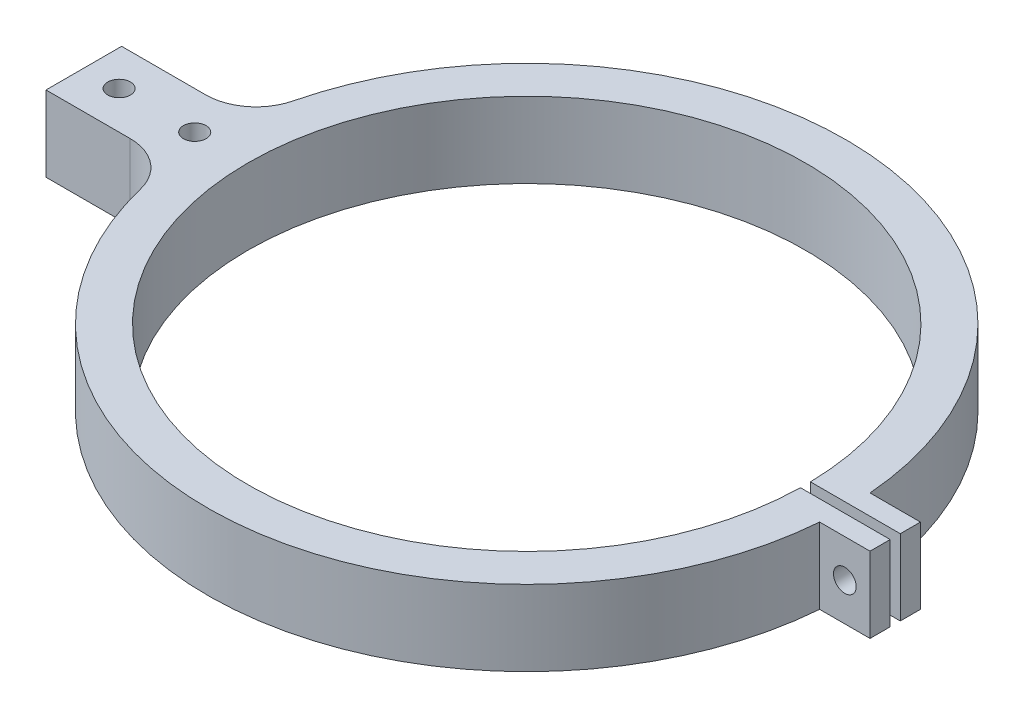
ISO-10303-21;
HEADER;
FILE_DESCRIPTION(('STEP AP214'),'2;1');
FILE_NAME('part.step','',(''),(''),'','','');
FILE_SCHEMA(('AUTOMOTIVE_DESIGN { 1 0 10303 214 1 1 1 1 }'));
ENDSEC;
DATA;
#1=APPLICATION_CONTEXT('core data for automotive mechanical design processes');
#2=APPLICATION_PROTOCOL_DEFINITION('international standard','automotive_design',2000,#1);
#3=PRODUCT_CONTEXT('',#1,'mechanical');
#4=PRODUCT('Part','Part','',(#3));
#5=PRODUCT_RELATED_PRODUCT_CATEGORY('part','',(#4));
#6=PRODUCT_DEFINITION_FORMATION('','',#4);
#7=PRODUCT_DEFINITION_CONTEXT('part definition',#1,'design');
#8=PRODUCT_DEFINITION('design','',#6,#7);
#9=PRODUCT_DEFINITION_SHAPE('','',#8);
#10=(LENGTH_UNIT() NAMED_UNIT(*) SI_UNIT(.MILLI.,.METRE.));
#11=(NAMED_UNIT(*) PLANE_ANGLE_UNIT() SI_UNIT($,.RADIAN.));
#12=(NAMED_UNIT(*) SI_UNIT($,.STERADIAN.) SOLID_ANGLE_UNIT());
#13=UNCERTAINTY_MEASURE_WITH_UNIT(LENGTH_MEASURE(1.E-05),#10,'distance_accuracy_value','');
#14=(GEOMETRIC_REPRESENTATION_CONTEXT(3) GLOBAL_UNCERTAINTY_ASSIGNED_CONTEXT((#13)) GLOBAL_UNIT_ASSIGNED_CONTEXT((#10,
#11,#12)) REPRESENTATION_CONTEXT('',''));
#15=CARTESIAN_POINT('',(0.,0.,0.));
#16=DIRECTION('',(0.,0.,1.));
#17=DIRECTION('',(1.,0.,0.));
#18=AXIS2_PLACEMENT_3D('',#15,#16,#17);
#19=CARTESIAN_POINT('',(0.,15.,0.));
#20=DIRECTION('',(0.,1.,0.));
#21=DIRECTION('',(0.,0.,1.));
#22=AXIS2_PLACEMENT_3D('',#19,#20,#21);
#23=PLANE('',#22);
#24=CARTESIAN_POINT('',(-80.8541168102774,15.,0.));
#25=DIRECTION('',(0.,1.,0.));
#26=DIRECTION('',(0.,0.,1.));
#27=AXIS2_PLACEMENT_3D('',#24,#25,#26);
#28=CIRCLE('',#27,2.25);
#29=CARTESIAN_POINT('',(-80.8541168102774,15.,2.25));
#30=VERTEX_POINT('',#29);
#31=EDGE_CURVE('E184',#30,#30,#28,.T.);
#32=ORIENTED_EDGE('',*,*,#31,.F.);
#33=EDGE_LOOP('',(#32));
#34=FACE_BOUND('',#33,.T.);
#35=CARTESIAN_POINT('',(0.,15.,0.));
#36=DIRECTION('',(0.,1.,0.));
#37=DIRECTION('',(0.,0.,1.));
#38=AXIS2_PLACEMENT_3D('',#35,#36,#37);
#39=CIRCLE('',#38,63.3);
#40=CARTESIAN_POINT('',(63.1022186614702,15.,-5.));
#41=VERTEX_POINT('',#40);
#42=CARTESIAN_POINT('',(-61.4695111209446,15.,-15.112551159618));
#43=VERTEX_POINT('',#42);
#44=EDGE_CURVE('E145',#41,#43,#39,.T.);
#45=ORIENTED_EDGE('',*,*,#44,.T.);
#46=CARTESIAN_POINT('',(-71.1803343627999,15.,-17.5));
#47=DIRECTION('',(0.,1.,0.));
#48=DIRECTION('',(0.,0.,1.));
#49=AXIS2_PLACEMENT_3D('',#46,#47,#48);
#50=CIRCLE('',#49,10.);
#51=CARTESIAN_POINT('',(-71.1803343627999,15.,-7.49999999999999));
#52=VERTEX_POINT('',#51);
#53=EDGE_CURVE('E141',#43,#52,#50,.F.);
#54=ORIENTED_EDGE('',*,*,#53,.T.);
#55=DIRECTION('',(-1.,0.,0.));
#56=VECTOR('',#55,1.);
#57=CARTESIAN_POINT('',(-87.8541168102774,15.,-7.5));
#58=LINE('',#57,#56);
#59=CARTESIAN_POINT('',(-87.8541168102774,15.,-7.5));
#60=VERTEX_POINT('',#59);
#61=EDGE_CURVE('E133',#52,#60,#58,.T.);
#62=ORIENTED_EDGE('',*,*,#61,.T.);
#63=DIRECTION('',(0.,0.,1.));
#64=VECTOR('',#63,1.);
#65=CARTESIAN_POINT('',(-87.8541168102774,15.,7.5));
#66=LINE('',#65,#64);
#67=CARTESIAN_POINT('',(-87.8541168102774,15.,7.5));
#68=VERTEX_POINT('',#67);
#69=EDGE_CURVE('E138',#60,#68,#66,.T.);
#70=ORIENTED_EDGE('',*,*,#69,.T.);
#71=DIRECTION('',(1.,0.,0.));
#72=VECTOR('',#71,1.);
#73=CARTESIAN_POINT('',(-87.8541168102774,15.,7.5));
#74=LINE('',#73,#72);
#75=CARTESIAN_POINT('',(-71.1803343627999,15.,7.50000000000001));
#76=VERTEX_POINT('',#75);
#77=EDGE_CURVE('E159',#68,#76,#74,.T.);
#78=ORIENTED_EDGE('',*,*,#77,.T.);
#79=CARTESIAN_POINT('',(-71.1803343627999,15.,17.5));
#80=DIRECTION('',(0.,1.,0.));
#81=DIRECTION('',(0.,0.,1.));
#82=AXIS2_PLACEMENT_3D('',#79,#80,#81);
#83=CIRCLE('',#82,10.);
#84=CARTESIAN_POINT('',(-61.4695111209446,15.,15.112551159618));
#85=VERTEX_POINT('',#84);
#86=EDGE_CURVE('E11',#76,#85,#83,.F.);
#87=ORIENTED_EDGE('',*,*,#86,.T.);
#88=CARTESIAN_POINT('',(0.,15.,0.));
#89=DIRECTION('',(0.,1.,0.));
#90=DIRECTION('',(0.,0.,1.));
#91=AXIS2_PLACEMENT_3D('',#88,#89,#90);
#92=CIRCLE('',#91,63.3);
#93=CARTESIAN_POINT('',(63.1022186614702,15.,5.00000000000003));
#94=VERTEX_POINT('',#93);
#95=EDGE_CURVE('E161',#85,#94,#92,.T.);
#96=ORIENTED_EDGE('',*,*,#95,.T.);
#97=DIRECTION('',(1.,0.,0.));
#98=VECTOR('',#97,1.);
#99=CARTESIAN_POINT('',(73.1022186614702,15.,5.));
#100=LINE('',#99,#98);
#101=CARTESIAN_POINT('',(73.1022186614702,15.,5.));
#102=VERTEX_POINT('',#101);
#103=EDGE_CURVE('E166',#94,#102,#100,.T.);
#104=ORIENTED_EDGE('',*,*,#103,.T.);
#105=DIRECTION('',(0.,0.,-1.));
#106=VECTOR('',#105,1.);
#107=CARTESIAN_POINT('',(73.1022186614702,15.,1.));
#108=LINE('',#107,#106);
#109=CARTESIAN_POINT('',(73.1022186614702,15.,1.));
#110=VERTEX_POINT('',#109);
#111=EDGE_CURVE('E168',#102,#110,#108,.T.);
#112=ORIENTED_EDGE('',*,*,#111,.T.);
#113=DIRECTION('',(-1.,0.,0.));
#114=VECTOR('',#113,1.);
#115=CARTESIAN_POINT('',(55.2909576694056,15.,1.));
#116=LINE('',#115,#114);
#117=CARTESIAN_POINT('',(55.2909576694056,15.,1.));
#118=VERTEX_POINT('',#117);
#119=EDGE_CURVE('E170',#110,#118,#116,.T.);
#120=ORIENTED_EDGE('',*,*,#119,.T.);
#121=CARTESIAN_POINT('',(0.,15.,0.));
#122=DIRECTION('',(0.,-1.,0.));
#123=DIRECTION('',(0.,0.,1.));
#124=AXIS2_PLACEMENT_3D('',#121,#122,#123);
#125=CIRCLE('',#124,55.3);
#126=CARTESIAN_POINT('',(55.2909576694056,15.,-1.));
#127=VERTEX_POINT('',#126);
#128=EDGE_CURVE('E172',#118,#127,#125,.T.);
#129=ORIENTED_EDGE('',*,*,#128,.T.);
#130=DIRECTION('',(1.,0.,0.));
#131=VECTOR('',#130,1.);
#132=CARTESIAN_POINT('',(55.2909576694056,15.,-1.));
#133=LINE('',#132,#131);
#134=CARTESIAN_POINT('',(73.1022186614702,15.,-1.));
#135=VERTEX_POINT('',#134);
#136=EDGE_CURVE('E174',#127,#135,#133,.T.);
#137=ORIENTED_EDGE('',*,*,#136,.T.);
#138=DIRECTION('',(0.,0.,-1.));
#139=VECTOR('',#138,1.);
#140=CARTESIAN_POINT('',(73.1022186614702,15.,-1.));
#141=LINE('',#140,#139);
#142=CARTESIAN_POINT('',(73.1022186614702,15.,-5.));
#143=VERTEX_POINT('',#142);
#144=EDGE_CURVE('E176',#135,#143,#141,.T.);
#145=ORIENTED_EDGE('',*,*,#144,.T.);
#146=DIRECTION('',(-1.,0.,0.));
#147=VECTOR('',#146,1.);
#148=CARTESIAN_POINT('',(73.1022186614702,15.,-5.));
#149=LINE('',#148,#147);
#150=EDGE_CURVE('E178',#143,#41,#149,.T.);
#151=ORIENTED_EDGE('',*,*,#150,.T.);
#152=EDGE_LOOP('',(#45,#54,#62,#70,#78,#87,#96,#104,#112,#120,#129,#137,#145,#151));
#153=FACE_BOUND('',#152,.T.);
#154=CARTESIAN_POINT('',(-65.8541168102774,15.,0.));
#155=DIRECTION('',(0.,1.,0.));
#156=DIRECTION('',(0.,0.,1.));
#157=AXIS2_PLACEMENT_3D('',#154,#155,#156);
#158=CIRCLE('',#157,2.25);
#159=CARTESIAN_POINT('',(-65.8541168102774,15.,2.25));
#160=VERTEX_POINT('',#159);
#161=EDGE_CURVE('E445',#160,#160,#158,.T.);
#162=ORIENTED_EDGE('',*,*,#161,.F.);
#163=EDGE_LOOP('',(#162));
#164=FACE_BOUND('',#163,.T.);
#165=ADVANCED_FACE('F33',(#34,#153,#164),#23,.T.);
#166=CARTESIAN_POINT('',(0.,0.,0.));
#167=DIRECTION('',(0.,1.,0.));
#168=DIRECTION('',(0.,0.,1.));
#169=AXIS2_PLACEMENT_3D('',#166,#167,#168);
#170=PLANE('',#169);
#171=CARTESIAN_POINT('',(0.,0.,0.));
#172=DIRECTION('',(0.,1.,0.));
#173=DIRECTION('',(0.,0.,1.));
#174=AXIS2_PLACEMENT_3D('',#171,#172,#173);
#175=CIRCLE('',#174,63.3);
#176=CARTESIAN_POINT('',(63.1022186614702,0.,-5.));
#177=VERTEX_POINT('',#176);
#178=CARTESIAN_POINT('',(-61.4695111209446,0.,-15.112551159618));
#179=VERTEX_POINT('',#178);
#180=EDGE_CURVE('E181',#177,#179,#175,.T.);
#181=ORIENTED_EDGE('',*,*,#180,.F.);
#182=DIRECTION('',(-1.,0.,0.));
#183=VECTOR('',#182,1.);
#184=CARTESIAN_POINT('',(73.1022186614702,0.,-5.));
#185=LINE('',#184,#183);
#186=CARTESIAN_POINT('',(73.1022186614702,0.,-5.));
#187=VERTEX_POINT('',#186);
#188=EDGE_CURVE('E204',#187,#177,#185,.T.);
#189=ORIENTED_EDGE('',*,*,#188,.F.);
#190=DIRECTION('',(0.,0.,-1.));
#191=VECTOR('',#190,1.);
#192=CARTESIAN_POINT('',(73.1022186614702,0.,-1.));
#193=LINE('',#192,#191);
#194=CARTESIAN_POINT('',(73.1022186614702,0.,-1.));
#195=VERTEX_POINT('',#194);
#196=EDGE_CURVE('E202',#195,#187,#193,.T.);
#197=ORIENTED_EDGE('',*,*,#196,.F.);
#198=DIRECTION('',(1.,0.,0.));
#199=VECTOR('',#198,1.);
#200=CARTESIAN_POINT('',(55.2909576694056,0.,-1.));
#201=LINE('',#200,#199);
#202=CARTESIAN_POINT('',(55.2909576694056,0.,-1.));
#203=VERTEX_POINT('',#202);
#204=EDGE_CURVE('E200',#203,#195,#201,.T.);
#205=ORIENTED_EDGE('',*,*,#204,.F.);
#206=CARTESIAN_POINT('',(0.,0.,0.));
#207=DIRECTION('',(0.,-1.,0.));
#208=DIRECTION('',(0.,0.,1.));
#209=AXIS2_PLACEMENT_3D('',#206,#207,#208);
#210=CIRCLE('',#209,55.3);
#211=CARTESIAN_POINT('',(55.2909576694056,0.,1.));
#212=VERTEX_POINT('',#211);
#213=EDGE_CURVE('E198',#212,#203,#210,.T.);
#214=ORIENTED_EDGE('',*,*,#213,.F.);
#215=DIRECTION('',(-1.,0.,0.));
#216=VECTOR('',#215,1.);
#217=CARTESIAN_POINT('',(55.2909576694056,0.,1.));
#218=LINE('',#217,#216);
#219=CARTESIAN_POINT('',(73.1022186614702,0.,1.));
#220=VERTEX_POINT('',#219);
#221=EDGE_CURVE('E196',#220,#212,#218,.T.);
#222=ORIENTED_EDGE('',*,*,#221,.F.);
#223=DIRECTION('',(0.,0.,-1.));
#224=VECTOR('',#223,1.);
#225=CARTESIAN_POINT('',(73.1022186614702,0.,1.));
#226=LINE('',#225,#224);
#227=CARTESIAN_POINT('',(73.1022186614702,0.,5.));
#228=VERTEX_POINT('',#227);
#229=EDGE_CURVE('E194',#228,#220,#226,.T.);
#230=ORIENTED_EDGE('',*,*,#229,.F.);
#231=DIRECTION('',(1.,0.,0.));
#232=VECTOR('',#231,1.);
#233=CARTESIAN_POINT('',(73.1022186614702,0.,5.));
#234=LINE('',#233,#232);
#235=CARTESIAN_POINT('',(63.1022186614702,0.,5.00000000000003));
#236=VERTEX_POINT('',#235);
#237=EDGE_CURVE('E192',#236,#228,#234,.T.);
#238=ORIENTED_EDGE('',*,*,#237,.F.);
#239=CARTESIAN_POINT('',(0.,0.,0.));
#240=DIRECTION('',(0.,1.,0.));
#241=DIRECTION('',(0.,0.,1.));
#242=AXIS2_PLACEMENT_3D('',#239,#240,#241);
#243=CIRCLE('',#242,63.3);
#244=CARTESIAN_POINT('',(-61.4695111209446,0.,15.112551159618));
#245=VERTEX_POINT('',#244);
#246=EDGE_CURVE('E190',#245,#236,#243,.T.);
#247=ORIENTED_EDGE('',*,*,#246,.F.);
#248=CARTESIAN_POINT('',(-71.1803343627999,0.,17.5));
#249=DIRECTION('',(0.,1.,0.));
#250=DIRECTION('',(0.,0.,1.));
#251=AXIS2_PLACEMENT_3D('',#248,#249,#250);
#252=CIRCLE('',#251,10.);
#253=CARTESIAN_POINT('',(-71.1803343627999,0.,7.50000000000001));
#254=VERTEX_POINT('',#253);
#255=EDGE_CURVE('E41',#245,#254,#252,.T.);
#256=ORIENTED_EDGE('',*,*,#255,.T.);
#257=DIRECTION('',(1.,0.,0.));
#258=VECTOR('',#257,1.);
#259=CARTESIAN_POINT('',(-87.8541168102774,0.,7.5));
#260=LINE('',#259,#258);
#261=CARTESIAN_POINT('',(-87.8541168102774,0.,7.5));
#262=VERTEX_POINT('',#261);
#263=EDGE_CURVE('E188',#262,#254,#260,.T.);
#264=ORIENTED_EDGE('',*,*,#263,.F.);
#265=DIRECTION('',(0.,0.,1.));
#266=VECTOR('',#265,1.);
#267=CARTESIAN_POINT('',(-87.8541168102774,0.,7.5));
#268=LINE('',#267,#266);
#269=CARTESIAN_POINT('',(-87.8541168102774,0.,-7.5));
#270=VERTEX_POINT('',#269);
#271=EDGE_CURVE('E186',#270,#262,#268,.T.);
#272=ORIENTED_EDGE('',*,*,#271,.F.);
#273=DIRECTION('',(-1.,0.,0.));
#274=VECTOR('',#273,1.);
#275=CARTESIAN_POINT('',(-87.8541168102774,0.,-7.5));
#276=LINE('',#275,#274);
#277=CARTESIAN_POINT('',(-71.1803343627999,0.,-7.49999999999999));
#278=VERTEX_POINT('',#277);
#279=EDGE_CURVE('E151',#278,#270,#276,.T.);
#280=ORIENTED_EDGE('',*,*,#279,.F.);
#281=CARTESIAN_POINT('',(-71.1803343627999,0.,-17.5));
#282=DIRECTION('',(0.,1.,0.));
#283=DIRECTION('',(0.,0.,1.));
#284=AXIS2_PLACEMENT_3D('',#281,#282,#283);
#285=CIRCLE('',#284,10.);
#286=EDGE_CURVE('E242',#278,#179,#285,.T.);
#287=ORIENTED_EDGE('',*,*,#286,.T.);
#288=EDGE_LOOP('',(#181,#189,#197,#205,#214,#222,#230,#238,#247,#256,#264,#272,#280,#287));
#289=FACE_BOUND('',#288,.T.);
#290=CARTESIAN_POINT('',(-80.8541168102774,0.,0.));
#291=DIRECTION('',(0.,1.,0.));
#292=DIRECTION('',(0.,0.,1.));
#293=AXIS2_PLACEMENT_3D('',#290,#291,#292);
#294=CIRCLE('',#293,2.25);
#295=CARTESIAN_POINT('',(-80.8541168102774,0.,2.25));
#296=VERTEX_POINT('',#295);
#297=EDGE_CURVE('E444',#296,#296,#294,.T.);
#298=ORIENTED_EDGE('',*,*,#297,.T.);
#299=EDGE_LOOP('',(#298));
#300=FACE_BOUND('',#299,.T.);
#301=CARTESIAN_POINT('',(-65.8541168102774,0.,0.));
#302=DIRECTION('',(0.,1.,0.));
#303=DIRECTION('',(0.,0.,1.));
#304=AXIS2_PLACEMENT_3D('',#301,#302,#303);
#305=CIRCLE('',#304,2.25);
#306=CARTESIAN_POINT('',(-65.8541168102774,0.,2.25));
#307=VERTEX_POINT('',#306);
#308=EDGE_CURVE('E449',#307,#307,#305,.T.);
#309=ORIENTED_EDGE('',*,*,#308,.T.);
#310=EDGE_LOOP('',(#309));
#311=FACE_BOUND('',#310,.T.);
#312=ADVANCED_FACE('F245',(#289,#300,#311),#170,.F.);
#313=CARTESIAN_POINT('',(0.,15.,0.));
#314=DIRECTION('',(0.,-1.,0.));
#315=DIRECTION('',(0.,0.,-1.));
#316=AXIS2_PLACEMENT_3D('',#313,#314,#315);
#317=CYLINDRICAL_SURFACE('',#316,63.3);
#318=ORIENTED_EDGE('',*,*,#180,.T.);
#319=DIRECTION('',(0.,-1.,0.));
#320=VECTOR('',#319,1.);
#321=CARTESIAN_POINT('',(-61.4695111209446,15.,-15.112551159618));
#322=LINE('',#321,#320);
#323=EDGE_CURVE('E236',#179,#43,#322,.F.);
#324=ORIENTED_EDGE('',*,*,#323,.T.);
#325=ORIENTED_EDGE('',*,*,#44,.F.);
#326=DIRECTION('',(0.,-1.,0.));
#327=VECTOR('',#326,1.);
#328=CARTESIAN_POINT('',(63.1022186614702,15.,-5.));
#329=LINE('',#328,#327);
#330=EDGE_CURVE('E180',#41,#177,#329,.T.);
#331=ORIENTED_EDGE('',*,*,#330,.T.);
#332=EDGE_LOOP('',(#318,#324,#325,#331));
#333=FACE_BOUND('',#332,.T.);
#334=ADVANCED_FACE('F251',(#333),#317,.T.);
#335=CARTESIAN_POINT('',(-87.8541168102774,15.,-7.5));
#336=DIRECTION('',(0.,0.,1.));
#337=DIRECTION('',(1.,0.,0.));
#338=AXIS2_PLACEMENT_3D('',#335,#336,#337);
#339=PLANE('',#338);
#340=ORIENTED_EDGE('',*,*,#61,.F.);
#341=DIRECTION('',(0.,1.,0.));
#342=VECTOR('',#341,1.);
#343=CARTESIAN_POINT('',(-71.1803343627999,0.,-7.49999999999999));
#344=LINE('',#343,#342);
#345=EDGE_CURVE('E154',#52,#278,#344,.F.);
#346=ORIENTED_EDGE('',*,*,#345,.T.);
#347=ORIENTED_EDGE('',*,*,#279,.T.);
#348=DIRECTION('',(0.,-1.,0.));
#349=VECTOR('',#348,1.);
#350=CARTESIAN_POINT('',(-87.8541168102774,15.,-7.5));
#351=LINE('',#350,#349);
#352=EDGE_CURVE('E148',#60,#270,#351,.T.);
#353=ORIENTED_EDGE('',*,*,#352,.F.);
#354=EDGE_LOOP('',(#340,#346,#347,#353));
#355=FACE_BOUND('',#354,.T.);
#356=ADVANCED_FACE('F149',(#355),#339,.F.);
#357=CARTESIAN_POINT('',(-87.8541168102774,15.,7.5));
#358=DIRECTION('',(1.,0.,0.));
#359=DIRECTION('',(0.,0.,-1.));
#360=AXIS2_PLACEMENT_3D('',#357,#358,#359);
#361=PLANE('',#360);
#362=ORIENTED_EDGE('',*,*,#271,.T.);
#363=DIRECTION('',(0.,-1.,0.));
#364=VECTOR('',#363,1.);
#365=CARTESIAN_POINT('',(-87.8541168102774,15.,7.5));
#366=LINE('',#365,#364);
#367=EDGE_CURVE('E155',#68,#262,#366,.T.);
#368=ORIENTED_EDGE('',*,*,#367,.F.);
#369=ORIENTED_EDGE('',*,*,#69,.F.);
#370=ORIENTED_EDGE('',*,*,#352,.T.);
#371=EDGE_LOOP('',(#362,#368,#369,#370));
#372=FACE_BOUND('',#371,.T.);
#373=ADVANCED_FACE('F157',(#372),#361,.F.);
#374=CARTESIAN_POINT('',(-87.8541168102774,15.,7.5));
#375=DIRECTION('',(0.,0.,-1.));
#376=DIRECTION('',(-1.,0.,0.));
#377=AXIS2_PLACEMENT_3D('',#374,#375,#376);
#378=PLANE('',#377);
#379=ORIENTED_EDGE('',*,*,#263,.T.);
#380=DIRECTION('',(0.,1.,0.));
#381=VECTOR('',#380,1.);
#382=CARTESIAN_POINT('',(-71.1803343627999,15.,7.50000000000001));
#383=LINE('',#382,#381);
#384=EDGE_CURVE('E48',#254,#76,#383,.T.);
#385=ORIENTED_EDGE('',*,*,#384,.T.);
#386=ORIENTED_EDGE('',*,*,#77,.F.);
#387=ORIENTED_EDGE('',*,*,#367,.T.);
#388=EDGE_LOOP('',(#379,#385,#386,#387));
#389=FACE_BOUND('',#388,.T.);
#390=ADVANCED_FACE('F310',(#389),#378,.F.);
#391=CARTESIAN_POINT('',(0.,15.,0.));
#392=DIRECTION('',(0.,-1.,0.));
#393=DIRECTION('',(0.,0.,-1.));
#394=AXIS2_PLACEMENT_3D('',#391,#392,#393);
#395=CYLINDRICAL_SURFACE('',#394,63.3);
#396=ORIENTED_EDGE('',*,*,#95,.F.);
#397=DIRECTION('',(0.,-1.,0.));
#398=VECTOR('',#397,1.);
#399=CARTESIAN_POINT('',(-61.4695111209446,15.,15.112551159618));
#400=LINE('',#399,#398);
#401=EDGE_CURVE('E238',#85,#245,#400,.T.);
#402=ORIENTED_EDGE('',*,*,#401,.T.);
#403=ORIENTED_EDGE('',*,*,#246,.T.);
#404=DIRECTION('',(0.,-1.,0.));
#405=VECTOR('',#404,1.);
#406=CARTESIAN_POINT('',(63.1022186614702,15.,5.00000000000003));
#407=LINE('',#406,#405);
#408=EDGE_CURVE('E226',#94,#236,#407,.T.);
#409=ORIENTED_EDGE('',*,*,#408,.F.);
#410=EDGE_LOOP('',(#396,#402,#403,#409));
#411=FACE_BOUND('',#410,.T.);
#412=ADVANCED_FACE('F306',(#411),#395,.T.);
#413=CARTESIAN_POINT('',(73.1022186614702,15.,5.));
#414=DIRECTION('',(0.,0.,-1.));
#415=DIRECTION('',(-1.,0.,0.));
#416=AXIS2_PLACEMENT_3D('',#413,#414,#415);
#417=PLANE('',#416);
#418=CARTESIAN_POINT('',(68.1022186614702,7.5,4.99999999999999));
#419=DIRECTION('',(0.,0.,1.));
#420=DIRECTION('',(1.,0.,0.));
#421=AXIS2_PLACEMENT_3D('',#418,#419,#420);
#422=CIRCLE('',#421,2.25);
#423=CARTESIAN_POINT('',(70.3522186614702,7.5,4.99999999999999));
#424=VERTEX_POINT('',#423);
#425=EDGE_CURVE('E234',#424,#424,#422,.T.);
#426=ORIENTED_EDGE('',*,*,#425,.F.);
#427=EDGE_LOOP('',(#426));
#428=FACE_BOUND('',#427,.T.);
#429=ORIENTED_EDGE('',*,*,#237,.T.);
#430=DIRECTION('',(0.,-1.,0.));
#431=VECTOR('',#430,1.);
#432=CARTESIAN_POINT('',(73.1022186614702,15.,5.));
#433=LINE('',#432,#431);
#434=EDGE_CURVE('E223',#102,#228,#433,.T.);
#435=ORIENTED_EDGE('',*,*,#434,.F.);
#436=ORIENTED_EDGE('',*,*,#103,.F.);
#437=ORIENTED_EDGE('',*,*,#408,.T.);
#438=EDGE_LOOP('',(#429,#435,#436,#437));
#439=FACE_BOUND('',#438,.T.);
#440=ADVANCED_FACE('F302',(#428,#439),#417,.F.);
#441=CARTESIAN_POINT('',(73.1022186614702,15.,1.));
#442=DIRECTION('',(-1.,0.,0.));
#443=DIRECTION('',(0.,0.,1.));
#444=AXIS2_PLACEMENT_3D('',#441,#442,#443);
#445=PLANE('',#444);
#446=ORIENTED_EDGE('',*,*,#229,.T.);
#447=DIRECTION('',(0.,-1.,0.));
#448=VECTOR('',#447,1.);
#449=CARTESIAN_POINT('',(73.1022186614702,15.,1.));
#450=LINE('',#449,#448);
#451=EDGE_CURVE('E220',#110,#220,#450,.T.);
#452=ORIENTED_EDGE('',*,*,#451,.F.);
#453=ORIENTED_EDGE('',*,*,#111,.F.);
#454=ORIENTED_EDGE('',*,*,#434,.T.);
#455=EDGE_LOOP('',(#446,#452,#453,#454));
#456=FACE_BOUND('',#455,.T.);
#457=ADVANCED_FACE('F298',(#456),#445,.F.);
#458=CARTESIAN_POINT('',(55.2909576694056,15.,1.));
#459=DIRECTION('',(0.,0.,1.));
#460=DIRECTION('',(1.,0.,0.));
#461=AXIS2_PLACEMENT_3D('',#458,#459,#460);
#462=PLANE('',#461);
#463=CARTESIAN_POINT('',(68.1022186614702,7.5,1.));
#464=DIRECTION('',(0.,0.,1.));
#465=DIRECTION('',(1.,0.,0.));
#466=AXIS2_PLACEMENT_3D('',#463,#464,#465);
#467=CIRCLE('',#466,2.25);
#468=CARTESIAN_POINT('',(70.3522186614702,7.5,1.));
#469=VERTEX_POINT('',#468);
#470=EDGE_CURVE('E480',#469,#469,#467,.T.);
#471=ORIENTED_EDGE('',*,*,#470,.T.);
#472=EDGE_LOOP('',(#471));
#473=FACE_BOUND('',#472,.T.);
#474=ORIENTED_EDGE('',*,*,#221,.T.);
#475=DIRECTION('',(0.,-1.,0.));
#476=VECTOR('',#475,1.);
#477=CARTESIAN_POINT('',(55.2909576694056,15.,1.));
#478=LINE('',#477,#476);
#479=EDGE_CURVE('E217',#118,#212,#478,.T.);
#480=ORIENTED_EDGE('',*,*,#479,.F.);
#481=ORIENTED_EDGE('',*,*,#119,.F.);
#482=ORIENTED_EDGE('',*,*,#451,.T.);
#483=EDGE_LOOP('',(#474,#480,#481,#482));
#484=FACE_BOUND('',#483,.T.);
#485=ADVANCED_FACE('F294',(#473,#484),#462,.F.);
#486=CARTESIAN_POINT('',(0.,15.,0.));
#487=DIRECTION('',(0.,-1.,0.));
#488=DIRECTION('',(0.,0.,-1.));
#489=AXIS2_PLACEMENT_3D('',#486,#487,#488);
#490=CYLINDRICAL_SURFACE('',#489,55.3);
#491=ORIENTED_EDGE('',*,*,#213,.T.);
#492=DIRECTION('',(0.,-1.,0.));
#493=VECTOR('',#492,1.);
#494=CARTESIAN_POINT('',(55.2909576694056,15.,-1.));
#495=LINE('',#494,#493);
#496=EDGE_CURVE('E214',#127,#203,#495,.T.);
#497=ORIENTED_EDGE('',*,*,#496,.F.);
#498=ORIENTED_EDGE('',*,*,#128,.F.);
#499=ORIENTED_EDGE('',*,*,#479,.T.);
#500=EDGE_LOOP('',(#491,#497,#498,#499));
#501=FACE_BOUND('',#500,.T.);
#502=ADVANCED_FACE('F290',(#501),#490,.F.);
#503=CARTESIAN_POINT('',(55.2909576694056,15.,-1.));
#504=DIRECTION('',(0.,0.,-1.));
#505=DIRECTION('',(-1.,0.,0.));
#506=AXIS2_PLACEMENT_3D('',#503,#504,#505);
#507=PLANE('',#506);
#508=CARTESIAN_POINT('',(68.1022186614702,7.5,-1.));
#509=DIRECTION('',(0.,0.,-1.));
#510=DIRECTION('',(-1.,0.,0.));
#511=AXIS2_PLACEMENT_3D('',#508,#509,#510);
#512=CIRCLE('',#511,2.25);
#513=CARTESIAN_POINT('',(65.8522186614702,7.5,-1.));
#514=VERTEX_POINT('',#513);
#515=EDGE_CURVE('E233',#514,#514,#512,.T.);
#516=ORIENTED_EDGE('',*,*,#515,.T.);
#517=EDGE_LOOP('',(#516));
#518=FACE_BOUND('',#517,.T.);
#519=ORIENTED_EDGE('',*,*,#204,.T.);
#520=DIRECTION('',(0.,-1.,0.));
#521=VECTOR('',#520,1.);
#522=CARTESIAN_POINT('',(73.1022186614702,15.,-1.));
#523=LINE('',#522,#521);
#524=EDGE_CURVE('E211',#135,#195,#523,.T.);
#525=ORIENTED_EDGE('',*,*,#524,.F.);
#526=ORIENTED_EDGE('',*,*,#136,.F.);
#527=ORIENTED_EDGE('',*,*,#496,.T.);
#528=EDGE_LOOP('',(#519,#525,#526,#527));
#529=FACE_BOUND('',#528,.T.);
#530=ADVANCED_FACE('F286',(#518,#529),#507,.F.);
#531=CARTESIAN_POINT('',(73.1022186614702,15.,-1.));
#532=DIRECTION('',(-1.,0.,0.));
#533=DIRECTION('',(0.,0.,1.));
#534=AXIS2_PLACEMENT_3D('',#531,#532,#533);
#535=PLANE('',#534);
#536=ORIENTED_EDGE('',*,*,#196,.T.);
#537=DIRECTION('',(0.,-1.,0.));
#538=VECTOR('',#537,1.);
#539=CARTESIAN_POINT('',(73.1022186614702,15.,-5.));
#540=LINE('',#539,#538);
#541=EDGE_CURVE('E208',#143,#187,#540,.T.);
#542=ORIENTED_EDGE('',*,*,#541,.F.);
#543=ORIENTED_EDGE('',*,*,#144,.F.);
#544=ORIENTED_EDGE('',*,*,#524,.T.);
#545=EDGE_LOOP('',(#536,#542,#543,#544));
#546=FACE_BOUND('',#545,.T.);
#547=ADVANCED_FACE('F282',(#546),#535,.F.);
#548=CARTESIAN_POINT('',(73.1022186614702,15.,-5.));
#549=DIRECTION('',(0.,0.,1.));
#550=DIRECTION('',(1.,0.,0.));
#551=AXIS2_PLACEMENT_3D('',#548,#549,#550);
#552=PLANE('',#551);
#553=CARTESIAN_POINT('',(68.1022186614702,7.5,-5.));
#554=DIRECTION('',(0.,0.,1.));
#555=DIRECTION('',(1.,0.,0.));
#556=AXIS2_PLACEMENT_3D('',#553,#554,#555);
#557=CIRCLE('',#556,2.25);
#558=CARTESIAN_POINT('',(70.3522186614702,7.5,-5.));
#559=VERTEX_POINT('',#558);
#560=EDGE_CURVE('E230',#559,#559,#557,.T.);
#561=ORIENTED_EDGE('',*,*,#560,.T.);
#562=EDGE_LOOP('',(#561));
#563=FACE_BOUND('',#562,.T.);
#564=ORIENTED_EDGE('',*,*,#188,.T.);
#565=ORIENTED_EDGE('',*,*,#330,.F.);
#566=ORIENTED_EDGE('',*,*,#150,.F.);
#567=ORIENTED_EDGE('',*,*,#541,.T.);
#568=EDGE_LOOP('',(#564,#565,#566,#567));
#569=FACE_BOUND('',#568,.T.);
#570=ADVANCED_FACE('F279',(#563,#569),#552,.F.);
#571=CARTESIAN_POINT('',(-80.8541168102774,15.,0.));
#572=DIRECTION('',(0.,-1.,0.));
#573=DIRECTION('',(0.,0.,-1.));
#574=AXIS2_PLACEMENT_3D('',#571,#572,#573);
#575=CYLINDRICAL_SURFACE('',#574,2.25);
#576=ORIENTED_EDGE('',*,*,#31,.T.);
#577=EDGE_LOOP('',(#576));
#578=FACE_BOUND('',#577,.T.);
#579=ORIENTED_EDGE('',*,*,#297,.F.);
#580=EDGE_LOOP('',(#579));
#581=FACE_BOUND('',#580,.T.);
#582=ADVANCED_FACE('F276',(#578,#581),#575,.F.);
#583=CARTESIAN_POINT('',(-65.8541168102774,15.,0.));
#584=DIRECTION('',(0.,-1.,0.));
#585=DIRECTION('',(0.,0.,-1.));
#586=AXIS2_PLACEMENT_3D('',#583,#584,#585);
#587=CYLINDRICAL_SURFACE('',#586,2.25);
#588=ORIENTED_EDGE('',*,*,#161,.T.);
#589=EDGE_LOOP('',(#588));
#590=FACE_BOUND('',#589,.T.);
#591=ORIENTED_EDGE('',*,*,#308,.F.);
#592=EDGE_LOOP('',(#591));
#593=FACE_BOUND('',#592,.T.);
#594=ADVANCED_FACE('F356',(#590,#593),#587,.F.);
#595=CARTESIAN_POINT('',(68.1022186614702,7.5,-15.));
#596=DIRECTION('',(0.,0.,1.));
#597=DIRECTION('',(1.,0.,0.));
#598=AXIS2_PLACEMENT_3D('',#595,#596,#597);
#599=CYLINDRICAL_SURFACE('',#598,2.25);
#600=ORIENTED_EDGE('',*,*,#560,.F.);
#601=EDGE_LOOP('',(#600));
#602=FACE_BOUND('',#601,.T.);
#603=ORIENTED_EDGE('',*,*,#515,.F.);
#604=EDGE_LOOP('',(#603));
#605=FACE_BOUND('',#604,.T.);
#606=ADVANCED_FACE('F262',(#602,#605),#599,.F.);
#607=ORIENTED_EDGE('',*,*,#425,.T.);
#608=EDGE_LOOP('',(#607));
#609=FACE_BOUND('',#608,.T.);
#610=ORIENTED_EDGE('',*,*,#470,.F.);
#611=EDGE_LOOP('',(#610));
#612=FACE_BOUND('',#611,.T.);
#613=ADVANCED_FACE('F256',(#609,#612),#599,.F.);
#614=CARTESIAN_POINT('',(-71.1803343627999,15.,-17.5));
#615=DIRECTION('',(0.,-1.,0.));
#616=DIRECTION('',(0.,0.,-1.));
#617=AXIS2_PLACEMENT_3D('',#614,#615,#616);
#618=CYLINDRICAL_SURFACE('',#617,10.);
#619=ORIENTED_EDGE('',*,*,#53,.F.);
#620=ORIENTED_EDGE('',*,*,#323,.F.);
#621=ORIENTED_EDGE('',*,*,#286,.F.);
#622=ORIENTED_EDGE('',*,*,#345,.F.);
#623=EDGE_LOOP('',(#619,#620,#621,#622));
#624=FACE_BOUND('',#623,.T.);
#625=ADVANCED_FACE('F254',(#624),#618,.F.);
#626=CARTESIAN_POINT('',(-71.1803343627999,15.,17.5));
#627=DIRECTION('',(0.,-1.,0.));
#628=DIRECTION('',(0.,0.,-1.));
#629=AXIS2_PLACEMENT_3D('',#626,#627,#628);
#630=CYLINDRICAL_SURFACE('',#629,10.);
#631=ORIENTED_EDGE('',*,*,#86,.F.);
#632=ORIENTED_EDGE('',*,*,#384,.F.);
#633=ORIENTED_EDGE('',*,*,#255,.F.);
#634=ORIENTED_EDGE('',*,*,#401,.F.);
#635=EDGE_LOOP('',(#631,#632,#633,#634));
#636=FACE_BOUND('',#635,.T.);
#637=ADVANCED_FACE('F35',(#636),#630,.F.);
#638=CLOSED_SHELL('',(#165,#312,#334,#356,#373,#390,#412,#440,#457,#485,#502,#530,#547,#570,
#582,#594,#606,#613,#625,#637));
#639=MANIFOLD_SOLID_BREP('B2',#638);
#640=ADVANCED_BREP_SHAPE_REPRESENTATION('',(#18,#639),#14);
#641=SHAPE_DEFINITION_REPRESENTATION(#9,#640);
ENDSEC;
END-ISO-10303-21;
